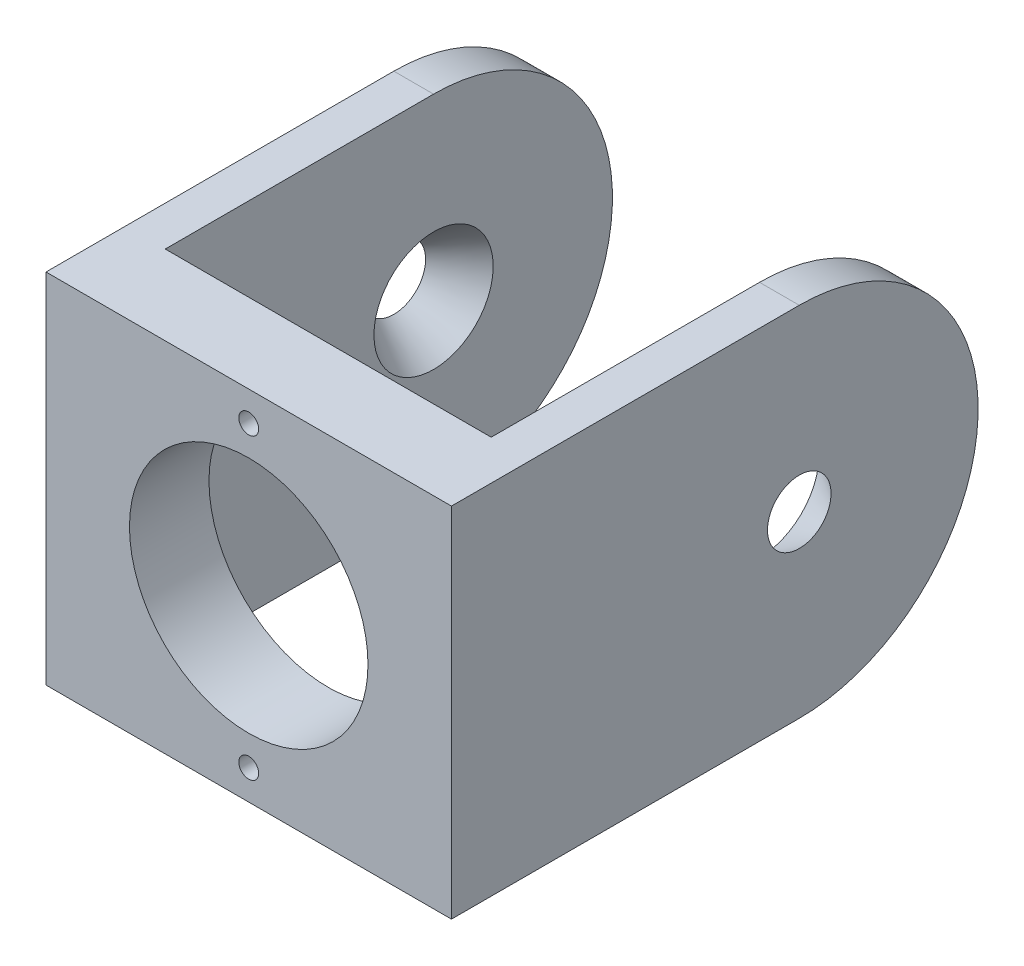
ISO-10303-21;
HEADER;
FILE_DESCRIPTION(('STEP AP214'),'2;1');
FILE_NAME('part.step','',(''),(''),'','','');
FILE_SCHEMA(('AUTOMOTIVE_DESIGN { 1 0 10303 214 1 1 1 1 }'));
ENDSEC;
DATA;
#1=APPLICATION_CONTEXT('core data for automotive mechanical design processes');
#2=APPLICATION_PROTOCOL_DEFINITION('international standard','automotive_design',2000,#1);
#3=PRODUCT_CONTEXT('',#1,'mechanical');
#4=PRODUCT('Part','Part','',(#3));
#5=PRODUCT_RELATED_PRODUCT_CATEGORY('part','',(#4));
#6=PRODUCT_DEFINITION_FORMATION('','',#4);
#7=PRODUCT_DEFINITION_CONTEXT('part definition',#1,'design');
#8=PRODUCT_DEFINITION('design','',#6,#7);
#9=PRODUCT_DEFINITION_SHAPE('','',#8);
#10=(LENGTH_UNIT() NAMED_UNIT(*) SI_UNIT(.MILLI.,.METRE.));
#11=(NAMED_UNIT(*) PLANE_ANGLE_UNIT() SI_UNIT($,.RADIAN.));
#12=(NAMED_UNIT(*) SI_UNIT($,.STERADIAN.) SOLID_ANGLE_UNIT());
#13=UNCERTAINTY_MEASURE_WITH_UNIT(LENGTH_MEASURE(1.E-05),#10,'distance_accuracy_value','');
#14=(GEOMETRIC_REPRESENTATION_CONTEXT(3) GLOBAL_UNCERTAINTY_ASSIGNED_CONTEXT((#13)) GLOBAL_UNIT_ASSIGNED_CONTEXT((#10,
#11,#12)) REPRESENTATION_CONTEXT('',''));
#15=CARTESIAN_POINT('',(0.,0.,0.));
#16=DIRECTION('',(0.,0.,1.));
#17=DIRECTION('',(1.,0.,0.));
#18=AXIS2_PLACEMENT_3D('',#15,#16,#17);
#19=CARTESIAN_POINT('',(0.,9.,2.));
#20=DIRECTION('',(0.,-1.,0.));
#21=DIRECTION('',(0.,0.,-1.));
#22=AXIS2_PLACEMENT_3D('',#19,#20,#21);
#23=PLANE('',#22);
#24=DIRECTION('',(-1.,0.,0.));
#25=VECTOR('',#24,1.);
#26=CARTESIAN_POINT('',(0.,9.,-2.));
#27=LINE('',#26,#25);
#28=CARTESIAN_POINT('',(8.2,9.,-2.));
#29=VERTEX_POINT('',#28);
#30=CARTESIAN_POINT('',(-8.2,9.,-2.));
#31=VERTEX_POINT('',#30);
#32=EDGE_CURVE('E151',#29,#31,#27,.T.);
#33=ORIENTED_EDGE('',*,*,#32,.T.);
#34=DIRECTION('',(0.,0.,-1.));
#35=VECTOR('',#34,1.);
#36=CARTESIAN_POINT('',(-8.2,9.,-2.));
#37=LINE('',#36,#35);
#38=CARTESIAN_POINT('',(-8.2,9.,-15.5));
#39=VERTEX_POINT('',#38);
#40=EDGE_CURVE('E154',#31,#39,#37,.T.);
#41=ORIENTED_EDGE('',*,*,#40,.T.);
#42=DIRECTION('',(1.,0.,0.));
#43=VECTOR('',#42,1.);
#44=CARTESIAN_POINT('',(-10.2,9.,-15.5));
#45=LINE('',#44,#43);
#46=CARTESIAN_POINT('',(-10.2,9.,-15.5));
#47=VERTEX_POINT('',#46);
#48=EDGE_CURVE('E192',#47,#39,#45,.T.);
#49=ORIENTED_EDGE('',*,*,#48,.F.);
#50=DIRECTION('',(0.,0.,1.));
#51=VECTOR('',#50,1.);
#52=CARTESIAN_POINT('',(-10.2,9.,2.));
#53=LINE('',#52,#51);
#54=CARTESIAN_POINT('',(-10.2,9.,2.));
#55=VERTEX_POINT('',#54);
#56=EDGE_CURVE('E181',#47,#55,#53,.T.);
#57=ORIENTED_EDGE('',*,*,#56,.T.);
#58=DIRECTION('',(-1.,0.,0.));
#59=VECTOR('',#58,1.);
#60=CARTESIAN_POINT('',(0.,9.,2.));
#61=LINE('',#60,#59);
#62=CARTESIAN_POINT('',(10.2,9.,2.));
#63=VERTEX_POINT('',#62);
#64=EDGE_CURVE('E95',#63,#55,#61,.T.);
#65=ORIENTED_EDGE('',*,*,#64,.F.);
#66=DIRECTION('',(0.,0.,1.));
#67=VECTOR('',#66,1.);
#68=CARTESIAN_POINT('',(10.2,9.,2.));
#69=LINE('',#68,#67);
#70=CARTESIAN_POINT('',(10.2,9.,-15.5));
#71=VERTEX_POINT('',#70);
#72=EDGE_CURVE('E214',#71,#63,#69,.T.);
#73=ORIENTED_EDGE('',*,*,#72,.F.);
#74=DIRECTION('',(-1.,0.,0.));
#75=VECTOR('',#74,1.);
#76=CARTESIAN_POINT('',(10.2,9.,-15.5));
#77=LINE('',#76,#75);
#78=CARTESIAN_POINT('',(8.2,9.,-15.5));
#79=VERTEX_POINT('',#78);
#80=EDGE_CURVE('E216',#71,#79,#77,.T.);
#81=ORIENTED_EDGE('',*,*,#80,.T.);
#82=DIRECTION('',(0.,0.,-1.));
#83=VECTOR('',#82,1.);
#84=CARTESIAN_POINT('',(8.2,9.,-2.));
#85=LINE('',#84,#83);
#86=EDGE_CURVE('E157',#29,#79,#85,.T.);
#87=ORIENTED_EDGE('',*,*,#86,.F.);
#88=EDGE_LOOP('',(#33,#41,#49,#57,#65,#73,#81,#87));
#89=FACE_BOUND('',#88,.T.);
#90=ADVANCED_FACE('F87',(#89),#23,.F.);
#91=CARTESIAN_POINT('',(0.,-9.,2.));
#92=DIRECTION('',(0.,1.,0.));
#93=DIRECTION('',(0.,0.,1.));
#94=AXIS2_PLACEMENT_3D('',#91,#92,#93);
#95=PLANE('',#94);
#96=DIRECTION('',(0.,0.,1.));
#97=VECTOR('',#96,1.);
#98=CARTESIAN_POINT('',(-8.2,-9.,-2.));
#99=LINE('',#98,#97);
#100=CARTESIAN_POINT('',(-8.2,-9.,-15.5));
#101=VERTEX_POINT('',#100);
#102=CARTESIAN_POINT('',(-8.2,-9.,-2.));
#103=VERTEX_POINT('',#102);
#104=EDGE_CURVE('E167',#101,#103,#99,.T.);
#105=ORIENTED_EDGE('',*,*,#104,.T.);
#106=DIRECTION('',(1.,0.,0.));
#107=VECTOR('',#106,1.);
#108=CARTESIAN_POINT('',(0.,-9.,-2.));
#109=LINE('',#108,#107);
#110=CARTESIAN_POINT('',(8.2,-9.,-2.));
#111=VERTEX_POINT('',#110);
#112=EDGE_CURVE('E90',#103,#111,#109,.T.);
#113=ORIENTED_EDGE('',*,*,#112,.T.);
#114=DIRECTION('',(0.,0.,1.));
#115=VECTOR('',#114,1.);
#116=CARTESIAN_POINT('',(8.2,-9.,-2.));
#117=LINE('',#116,#115);
#118=CARTESIAN_POINT('',(8.2,-9.,-15.5));
#119=VERTEX_POINT('',#118);
#120=EDGE_CURVE('E202',#119,#111,#117,.T.);
#121=ORIENTED_EDGE('',*,*,#120,.F.);
#122=DIRECTION('',(-1.,0.,0.));
#123=VECTOR('',#122,1.);
#124=CARTESIAN_POINT('',(10.2,-9.,-15.5));
#125=LINE('',#124,#123);
#126=CARTESIAN_POINT('',(10.2,-9.,-15.5));
#127=VERTEX_POINT('',#126);
#128=EDGE_CURVE('E161',#127,#119,#125,.T.);
#129=ORIENTED_EDGE('',*,*,#128,.F.);
#130=DIRECTION('',(0.,0.,-1.));
#131=VECTOR('',#130,1.);
#132=CARTESIAN_POINT('',(10.2,-9.,2.));
#133=LINE('',#132,#131);
#134=CARTESIAN_POINT('',(10.2,-9.,2.));
#135=VERTEX_POINT('',#134);
#136=EDGE_CURVE('E211',#135,#127,#133,.T.);
#137=ORIENTED_EDGE('',*,*,#136,.F.);
#138=DIRECTION('',(1.,0.,0.));
#139=VECTOR('',#138,1.);
#140=CARTESIAN_POINT('',(0.,-9.,2.));
#141=LINE('',#140,#139);
#142=CARTESIAN_POINT('',(-10.2,-9.,2.));
#143=VERTEX_POINT('',#142);
#144=EDGE_CURVE('E12',#143,#135,#141,.T.);
#145=ORIENTED_EDGE('',*,*,#144,.F.);
#146=DIRECTION('',(0.,0.,-1.));
#147=VECTOR('',#146,1.);
#148=CARTESIAN_POINT('',(-10.2,-9.,2.));
#149=LINE('',#148,#147);
#150=CARTESIAN_POINT('',(-10.2,-9.,-15.5));
#151=VERTEX_POINT('',#150);
#152=EDGE_CURVE('E186',#143,#151,#149,.T.);
#153=ORIENTED_EDGE('',*,*,#152,.T.);
#154=DIRECTION('',(1.,0.,0.));
#155=VECTOR('',#154,1.);
#156=CARTESIAN_POINT('',(-10.2,-9.,-15.5));
#157=LINE('',#156,#155);
#158=EDGE_CURVE('E189',#151,#101,#157,.T.);
#159=ORIENTED_EDGE('',*,*,#158,.T.);
#160=EDGE_LOOP('',(#105,#113,#121,#129,#137,#145,#153,#159));
#161=FACE_BOUND('',#160,.T.);
#162=ADVANCED_FACE('F225',(#161),#95,.F.);
#163=CARTESIAN_POINT('',(-10.2,0.,-15.5));
#164=DIRECTION('',(1.,0.,0.));
#165=DIRECTION('',(0.,0.,-1.));
#166=AXIS2_PLACEMENT_3D('',#163,#164,#165);
#167=CYLINDRICAL_SURFACE('',#166,9.);
#168=ORIENTED_EDGE('',*,*,#48,.T.);
#169=CARTESIAN_POINT('',(-8.2,0.,-15.5));
#170=DIRECTION('',(1.,0.,0.));
#171=DIRECTION('',(0.,0.,-1.));
#172=AXIS2_PLACEMENT_3D('',#169,#170,#171);
#173=CIRCLE('',#172,9.);
#174=EDGE_CURVE('E171',#101,#39,#173,.T.);
#175=ORIENTED_EDGE('',*,*,#174,.F.);
#176=ORIENTED_EDGE('',*,*,#158,.F.);
#177=CARTESIAN_POINT('',(-10.2,0.,-15.5));
#178=DIRECTION('',(1.,0.,0.));
#179=DIRECTION('',(0.,0.,1.));
#180=AXIS2_PLACEMENT_3D('',#177,#178,#179);
#181=CIRCLE('',#180,9.);
#182=EDGE_CURVE('E183',#151,#47,#181,.T.);
#183=ORIENTED_EDGE('',*,*,#182,.T.);
#184=EDGE_LOOP('',(#168,#175,#176,#183));
#185=FACE_BOUND('',#184,.T.);
#186=ADVANCED_FACE('F241',(#185),#167,.T.);
#187=CARTESIAN_POINT('',(0.,0.,2.));
#188=DIRECTION('',(0.,0.,1.));
#189=DIRECTION('',(1.,0.,0.));
#190=AXIS2_PLACEMENT_3D('',#187,#188,#189);
#191=PLANE('',#190);
#192=CARTESIAN_POINT('',(0.,-7.5,2.));
#193=DIRECTION('',(0.,0.,1.));
#194=DIRECTION('',(1.,0.,0.));
#195=AXIS2_PLACEMENT_3D('',#192,#193,#194);
#196=CIRCLE('',#195,0.5);
#197=CARTESIAN_POINT('',(0.500000000000002,-7.5,2.));
#198=VERTEX_POINT('',#197);
#199=EDGE_CURVE('E402',#198,#198,#196,.T.);
#200=ORIENTED_EDGE('',*,*,#199,.F.);
#201=EDGE_LOOP('',(#200));
#202=FACE_BOUND('',#201,.T.);
#203=CARTESIAN_POINT('',(0.,7.5,2.));
#204=DIRECTION('',(0.,0.,1.));
#205=DIRECTION('',(1.,0.,0.));
#206=AXIS2_PLACEMENT_3D('',#203,#204,#205);
#207=CIRCLE('',#206,0.5);
#208=CARTESIAN_POINT('',(0.500000000000002,7.5,2.));
#209=VERTEX_POINT('',#208);
#210=EDGE_CURVE('E399',#209,#209,#207,.F.);
#211=ORIENTED_EDGE('',*,*,#210,.T.);
#212=EDGE_LOOP('',(#211));
#213=FACE_BOUND('',#212,.T.);
#214=CARTESIAN_POINT('',(0.,0.,2.));
#215=DIRECTION('',(0.,0.,1.));
#216=DIRECTION('',(1.,0.,0.));
#217=AXIS2_PLACEMENT_3D('',#214,#215,#216);
#218=CIRCLE('',#217,6.);
#219=CARTESIAN_POINT('',(6.,0.,2.));
#220=VERTEX_POINT('',#219);
#221=EDGE_CURVE('E393',#220,#220,#218,.F.);
#222=ORIENTED_EDGE('',*,*,#221,.T.);
#223=EDGE_LOOP('',(#222));
#224=FACE_BOUND('',#223,.T.);
#225=ORIENTED_EDGE('',*,*,#64,.T.);
#226=DIRECTION('',(0.,-1.,0.));
#227=VECTOR('',#226,1.);
#228=CARTESIAN_POINT('',(-10.2,9.,2.));
#229=LINE('',#228,#227);
#230=EDGE_CURVE('E178',#55,#143,#229,.T.);
#231=ORIENTED_EDGE('',*,*,#230,.T.);
#232=ORIENTED_EDGE('',*,*,#144,.T.);
#233=DIRECTION('',(0.,-1.,0.));
#234=VECTOR('',#233,1.);
#235=CARTESIAN_POINT('',(10.2,9.,2.));
#236=LINE('',#235,#234);
#237=EDGE_CURVE('E208',#63,#135,#236,.T.);
#238=ORIENTED_EDGE('',*,*,#237,.F.);
#239=EDGE_LOOP('',(#225,#231,#232,#238));
#240=FACE_BOUND('',#239,.T.);
#241=ADVANCED_FACE('F233',(#202,#213,#224,#240),#191,.T.);
#242=CARTESIAN_POINT('',(0.,0.,-2.));
#243=DIRECTION('',(0.,0.,1.));
#244=DIRECTION('',(1.,0.,0.));
#245=AXIS2_PLACEMENT_3D('',#242,#243,#244);
#246=PLANE('',#245);
#247=CARTESIAN_POINT('',(0.,-7.5,-2.));
#248=DIRECTION('',(0.,0.,1.));
#249=DIRECTION('',(-1.,0.,0.));
#250=AXIS2_PLACEMENT_3D('',#247,#248,#249);
#251=CIRCLE('',#250,0.5);
#252=CARTESIAN_POINT('',(-0.499999999999997,-7.5,-2.));
#253=VERTEX_POINT('',#252);
#254=EDGE_CURVE('E406',#253,#253,#251,.T.);
#255=ORIENTED_EDGE('',*,*,#254,.T.);
#256=EDGE_LOOP('',(#255));
#257=FACE_BOUND('',#256,.T.);
#258=CARTESIAN_POINT('',(0.,7.5,-2.));
#259=DIRECTION('',(0.,0.,-1.));
#260=DIRECTION('',(-1.,0.,0.));
#261=AXIS2_PLACEMENT_3D('',#258,#259,#260);
#262=CIRCLE('',#261,0.5);
#263=CARTESIAN_POINT('',(-0.499999999999997,7.5,-2.));
#264=VERTEX_POINT('',#263);
#265=EDGE_CURVE('E396',#264,#264,#262,.T.);
#266=ORIENTED_EDGE('',*,*,#265,.F.);
#267=EDGE_LOOP('',(#266));
#268=FACE_BOUND('',#267,.T.);
#269=CARTESIAN_POINT('',(0.,0.,-2.));
#270=DIRECTION('',(0.,0.,-1.));
#271=DIRECTION('',(-1.,0.,0.));
#272=AXIS2_PLACEMENT_3D('',#269,#270,#271);
#273=CIRCLE('',#272,6.);
#274=CARTESIAN_POINT('',(-6.,0.,-2.));
#275=VERTEX_POINT('',#274);
#276=EDGE_CURVE('E391',#275,#275,#273,.T.);
#277=ORIENTED_EDGE('',*,*,#276,.F.);
#278=EDGE_LOOP('',(#277));
#279=FACE_BOUND('',#278,.T.);
#280=DIRECTION('',(0.,1.,0.));
#281=VECTOR('',#280,1.);
#282=CARTESIAN_POINT('',(8.2,-9.001,-2.));
#283=LINE('',#282,#281);
#284=EDGE_CURVE('E206',#111,#29,#283,.T.);
#285=ORIENTED_EDGE('',*,*,#284,.F.);
#286=ORIENTED_EDGE('',*,*,#112,.F.);
#287=DIRECTION('',(0.,1.,0.));
#288=VECTOR('',#287,1.);
#289=CARTESIAN_POINT('',(-8.2,-9.001,-2.));
#290=LINE('',#289,#288);
#291=EDGE_CURVE('E163',#103,#31,#290,.T.);
#292=ORIENTED_EDGE('',*,*,#291,.T.);
#293=ORIENTED_EDGE('',*,*,#32,.F.);
#294=EDGE_LOOP('',(#285,#286,#292,#293));
#295=FACE_BOUND('',#294,.T.);
#296=ADVANCED_FACE('F164',(#257,#268,#279,#295),#246,.F.);
#297=CARTESIAN_POINT('',(10.2,0.,-15.5));
#298=DIRECTION('',(-1.,0.,0.));
#299=DIRECTION('',(0.,0.,1.));
#300=AXIS2_PLACEMENT_3D('',#297,#298,#299);
#301=CYLINDRICAL_SURFACE('',#300,9.);
#302=ORIENTED_EDGE('',*,*,#128,.T.);
#303=CARTESIAN_POINT('',(8.2,0.,-15.5));
#304=DIRECTION('',(1.,0.,0.));
#305=DIRECTION('',(0.,0.,-1.));
#306=AXIS2_PLACEMENT_3D('',#303,#304,#305);
#307=CIRCLE('',#306,9.);
#308=EDGE_CURVE('E200',#79,#119,#307,.F.);
#309=ORIENTED_EDGE('',*,*,#308,.F.);
#310=ORIENTED_EDGE('',*,*,#80,.F.);
#311=CARTESIAN_POINT('',(10.2,0.,-15.5));
#312=DIRECTION('',(1.,0.,0.));
#313=DIRECTION('',(0.,0.,1.));
#314=AXIS2_PLACEMENT_3D('',#311,#312,#313);
#315=CIRCLE('',#314,9.);
#316=EDGE_CURVE('E109',#127,#71,#315,.T.);
#317=ORIENTED_EDGE('',*,*,#316,.F.);
#318=EDGE_LOOP('',(#302,#309,#310,#317));
#319=FACE_BOUND('',#318,.T.);
#320=ADVANCED_FACE('F231',(#319),#301,.T.);
#321=CARTESIAN_POINT('',(10.2,0.,-15.5));
#322=DIRECTION('',(-1.,0.,0.));
#323=DIRECTION('',(0.,0.,1.));
#324=AXIS2_PLACEMENT_3D('',#321,#322,#323);
#325=PLANE('',#324);
#326=CARTESIAN_POINT('',(10.2,0.,-15.5));
#327=DIRECTION('',(-1.,0.,0.));
#328=DIRECTION('',(0.,0.,1.));
#329=AXIS2_PLACEMENT_3D('',#326,#327,#328);
#330=CIRCLE('',#329,1.59958492358058);
#331=CARTESIAN_POINT('',(10.2,0.,-13.9004150764194));
#332=VERTEX_POINT('',#331);
#333=EDGE_CURVE('E197',#332,#332,#330,.F.);
#334=ORIENTED_EDGE('',*,*,#333,.F.);
#335=EDGE_LOOP('',(#334));
#336=FACE_BOUND('',#335,.T.);
#337=ORIENTED_EDGE('',*,*,#237,.T.);
#338=ORIENTED_EDGE('',*,*,#136,.T.);
#339=ORIENTED_EDGE('',*,*,#316,.T.);
#340=ORIENTED_EDGE('',*,*,#72,.T.);
#341=EDGE_LOOP('',(#337,#338,#339,#340));
#342=FACE_BOUND('',#341,.T.);
#343=ADVANCED_FACE('F232',(#336,#342),#325,.F.);
#344=CARTESIAN_POINT('',(8.2,-9.001,-2.));
#345=DIRECTION('',(1.,0.,0.));
#346=DIRECTION('',(0.,0.,-1.));
#347=AXIS2_PLACEMENT_3D('',#344,#345,#346);
#348=PLANE('',#347);
#349=CARTESIAN_POINT('',(8.2,0.,-15.5));
#350=DIRECTION('',(-1.,0.,0.));
#351=DIRECTION('',(0.,0.,1.));
#352=AXIS2_PLACEMENT_3D('',#349,#350,#351);
#353=CIRCLE('',#352,3.);
#354=CARTESIAN_POINT('',(8.2,0.,-12.5));
#355=VERTEX_POINT('',#354);
#356=EDGE_CURVE('E194',#355,#355,#353,.T.);
#357=ORIENTED_EDGE('',*,*,#356,.F.);
#358=EDGE_LOOP('',(#357));
#359=FACE_BOUND('',#358,.T.);
#360=ORIENTED_EDGE('',*,*,#120,.T.);
#361=ORIENTED_EDGE('',*,*,#284,.T.);
#362=ORIENTED_EDGE('',*,*,#86,.T.);
#363=ORIENTED_EDGE('',*,*,#308,.T.);
#364=EDGE_LOOP('',(#360,#361,#362,#363));
#365=FACE_BOUND('',#364,.T.);
#366=ADVANCED_FACE('F228',(#359,#365),#348,.F.);
#367=CARTESIAN_POINT('',(8.2,0.,-15.5));
#368=DIRECTION('',(-1.,0.,0.));
#369=DIRECTION('',(0.,0.,1.));
#370=AXIS2_PLACEMENT_3D('',#367,#368,#369);
#371=CONICAL_SURFACE('',#370,3.,0.610865238198016);
#372=ORIENTED_EDGE('',*,*,#356,.T.);
#373=EDGE_LOOP('',(#372));
#374=FACE_BOUND('',#373,.T.);
#375=ORIENTED_EDGE('',*,*,#333,.T.);
#376=EDGE_LOOP('',(#375));
#377=FACE_BOUND('',#376,.T.);
#378=ADVANCED_FACE('F261',(#374,#377),#371,.F.);
#379=CARTESIAN_POINT('',(-10.2,0.,-15.5));
#380=DIRECTION('',(1.,0.,0.));
#381=DIRECTION('',(0.,0.,1.));
#382=AXIS2_PLACEMENT_3D('',#379,#380,#381);
#383=PLANE('',#382);
#384=CARTESIAN_POINT('',(-10.2,0.,-15.5));
#385=DIRECTION('',(1.,0.,0.));
#386=DIRECTION('',(0.,0.,-1.));
#387=AXIS2_PLACEMENT_3D('',#384,#385,#386);
#388=CIRCLE('',#387,1.59958492358058);
#389=CARTESIAN_POINT('',(-10.2,0.,-17.0995849235806));
#390=VERTEX_POINT('',#389);
#391=EDGE_CURVE('E388',#390,#390,#388,.T.);
#392=ORIENTED_EDGE('',*,*,#391,.T.);
#393=EDGE_LOOP('',(#392));
#394=FACE_BOUND('',#393,.T.);
#395=ORIENTED_EDGE('',*,*,#230,.F.);
#396=ORIENTED_EDGE('',*,*,#56,.F.);
#397=ORIENTED_EDGE('',*,*,#182,.F.);
#398=ORIENTED_EDGE('',*,*,#152,.F.);
#399=EDGE_LOOP('',(#395,#396,#397,#398));
#400=FACE_BOUND('',#399,.T.);
#401=ADVANCED_FACE('F238',(#394,#400),#383,.F.);
#402=CARTESIAN_POINT('',(-8.2,-9.001,-2.));
#403=DIRECTION('',(1.,0.,0.));
#404=DIRECTION('',(0.,0.,-1.));
#405=AXIS2_PLACEMENT_3D('',#402,#403,#404);
#406=PLANE('',#405);
#407=CARTESIAN_POINT('',(-8.2,0.,-15.5));
#408=DIRECTION('',(-1.,0.,0.));
#409=DIRECTION('',(0.,0.,1.));
#410=AXIS2_PLACEMENT_3D('',#407,#408,#409);
#411=CIRCLE('',#410,3.);
#412=CARTESIAN_POINT('',(-8.2,0.,-12.5));
#413=VERTEX_POINT('',#412);
#414=EDGE_CURVE('E173',#413,#413,#411,.T.);
#415=ORIENTED_EDGE('',*,*,#414,.T.);
#416=EDGE_LOOP('',(#415));
#417=FACE_BOUND('',#416,.T.);
#418=ORIENTED_EDGE('',*,*,#174,.T.);
#419=ORIENTED_EDGE('',*,*,#40,.F.);
#420=ORIENTED_EDGE('',*,*,#291,.F.);
#421=ORIENTED_EDGE('',*,*,#104,.F.);
#422=EDGE_LOOP('',(#418,#419,#420,#421));
#423=FACE_BOUND('',#422,.T.);
#424=ADVANCED_FACE('F169',(#417,#423),#406,.T.);
#425=CARTESIAN_POINT('',(-8.2,0.,-15.5));
#426=DIRECTION('',(1.,0.,0.));
#427=DIRECTION('',(0.,0.,1.));
#428=AXIS2_PLACEMENT_3D('',#425,#426,#427);
#429=CONICAL_SURFACE('',#428,3.,0.610865238198016);
#430=ORIENTED_EDGE('',*,*,#414,.F.);
#431=EDGE_LOOP('',(#430));
#432=FACE_BOUND('',#431,.T.);
#433=ORIENTED_EDGE('',*,*,#391,.F.);
#434=EDGE_LOOP('',(#433));
#435=FACE_BOUND('',#434,.T.);
#436=ADVANCED_FACE('F337',(#432,#435),#429,.F.);
#437=CARTESIAN_POINT('',(0.,0.,2.001));
#438=DIRECTION('',(0.,0.,-1.));
#439=DIRECTION('',(-1.,0.,0.));
#440=AXIS2_PLACEMENT_3D('',#437,#438,#439);
#441=CYLINDRICAL_SURFACE('',#440,6.);
#442=ORIENTED_EDGE('',*,*,#221,.F.);
#443=EDGE_LOOP('',(#442));
#444=FACE_BOUND('',#443,.T.);
#445=ORIENTED_EDGE('',*,*,#276,.T.);
#446=EDGE_LOOP('',(#445));
#447=FACE_BOUND('',#446,.T.);
#448=ADVANCED_FACE('F351',(#444,#447),#441,.F.);
#449=CARTESIAN_POINT('',(0.,7.5,2.001));
#450=DIRECTION('',(0.,0.,-1.));
#451=DIRECTION('',(-1.,0.,0.));
#452=AXIS2_PLACEMENT_3D('',#449,#450,#451);
#453=CYLINDRICAL_SURFACE('',#452,0.5);
#454=ORIENTED_EDGE('',*,*,#210,.F.);
#455=EDGE_LOOP('',(#454));
#456=FACE_BOUND('',#455,.T.);
#457=ORIENTED_EDGE('',*,*,#265,.T.);
#458=EDGE_LOOP('',(#457));
#459=FACE_BOUND('',#458,.T.);
#460=ADVANCED_FACE('F357',(#456,#459),#453,.F.);
#461=CARTESIAN_POINT('',(0.,-7.5,2.001));
#462=DIRECTION('',(0.,0.,-1.));
#463=DIRECTION('',(-1.,0.,0.));
#464=AXIS2_PLACEMENT_3D('',#461,#462,#463);
#465=CYLINDRICAL_SURFACE('',#464,0.5);
#466=ORIENTED_EDGE('',*,*,#199,.T.);
#467=EDGE_LOOP('',(#466));
#468=FACE_BOUND('',#467,.T.);
#469=ORIENTED_EDGE('',*,*,#254,.F.);
#470=EDGE_LOOP('',(#469));
#471=FACE_BOUND('',#470,.T.);
#472=ADVANCED_FACE('F366',(#468,#471),#465,.F.);
#473=CLOSED_SHELL('',(#90,#162,#186,#241,#296,#320,#343,#366,#378,#401,#424,#436,#448,#460,#472));
#474=MANIFOLD_SOLID_BREP('B2',#473);
#475=ADVANCED_BREP_SHAPE_REPRESENTATION('',(#18,#474),#14);
#476=SHAPE_DEFINITION_REPRESENTATION(#9,#475);
ENDSEC;
END-ISO-10303-21;
